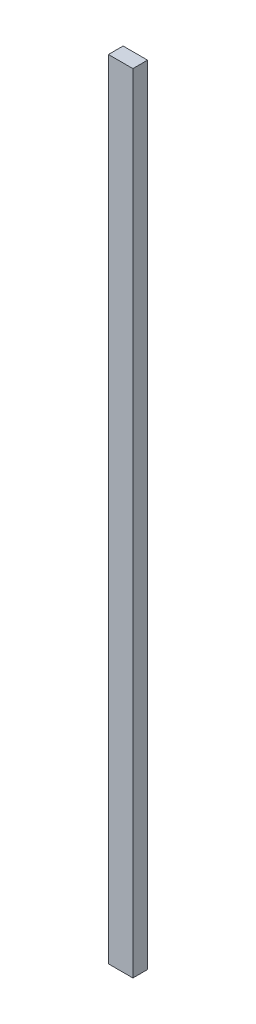
ISO-10303-21;
HEADER;
FILE_DESCRIPTION(('STEP AP214'),'2;1');
FILE_NAME('part.step','',(''),(''),'','','');
FILE_SCHEMA(('AUTOMOTIVE_DESIGN { 1 0 10303 214 1 1 1 1 }'));
ENDSEC;
DATA;
#1=APPLICATION_CONTEXT('core data for automotive mechanical design processes');
#2=APPLICATION_PROTOCOL_DEFINITION('international standard','automotive_design',2000,#1);
#3=PRODUCT_CONTEXT('',#1,'mechanical');
#4=PRODUCT('Part','Part','',(#3));
#5=PRODUCT_RELATED_PRODUCT_CATEGORY('part','',(#4));
#6=PRODUCT_DEFINITION_FORMATION('','',#4);
#7=PRODUCT_DEFINITION_CONTEXT('part definition',#1,'design');
#8=PRODUCT_DEFINITION('design','',#6,#7);
#9=PRODUCT_DEFINITION_SHAPE('','',#8);
#10=(LENGTH_UNIT() NAMED_UNIT(*) SI_UNIT(.MILLI.,.METRE.));
#11=(NAMED_UNIT(*) PLANE_ANGLE_UNIT() SI_UNIT($,.RADIAN.));
#12=(NAMED_UNIT(*) SI_UNIT($,.STERADIAN.) SOLID_ANGLE_UNIT());
#13=UNCERTAINTY_MEASURE_WITH_UNIT(LENGTH_MEASURE(1.E-05),#10,'distance_accuracy_value','');
#14=(GEOMETRIC_REPRESENTATION_CONTEXT(3) GLOBAL_UNCERTAINTY_ASSIGNED_CONTEXT((#13)) GLOBAL_UNIT_ASSIGNED_CONTEXT((#10,
#11,#12)) REPRESENTATION_CONTEXT('',''));
#15=CARTESIAN_POINT('',(0.,0.,0.));
#16=DIRECTION('',(0.,0.,1.));
#17=DIRECTION('',(1.,0.,0.));
#18=AXIS2_PLACEMENT_3D('',#15,#16,#17);
#19=CARTESIAN_POINT('',(0.,0.,6.));
#20=DIRECTION('',(0.,0.,1.));
#21=DIRECTION('',(1.,0.,0.));
#22=AXIS2_PLACEMENT_3D('',#19,#20,#21);
#23=PLANE('',#22);
#24=DIRECTION('',(-1.,0.,0.));
#25=VECTOR('',#24,1.);
#26=CARTESIAN_POINT('',(0.,-161.,6.));
#27=LINE('',#26,#25);
#28=CARTESIAN_POINT('',(5.,-161.,6.));
#29=VERTEX_POINT('',#28);
#30=CARTESIAN_POINT('',(-5.,-161.,6.));
#31=VERTEX_POINT('',#30);
#32=EDGE_CURVE('E11',#29,#31,#27,.T.);
#33=ORIENTED_EDGE('',*,*,#32,.F.);
#34=DIRECTION('',(0.,-1.,0.));
#35=VECTOR('',#34,1.);
#36=CARTESIAN_POINT('',(5.,0.,6.));
#37=LINE('',#36,#35);
#38=CARTESIAN_POINT('',(5.,161.,6.));
#39=VERTEX_POINT('',#38);
#40=EDGE_CURVE('E62',#39,#29,#37,.T.);
#41=ORIENTED_EDGE('',*,*,#40,.F.);
#42=DIRECTION('',(1.,0.,0.));
#43=VECTOR('',#42,1.);
#44=CARTESIAN_POINT('',(0.,161.,6.));
#45=LINE('',#44,#43);
#46=CARTESIAN_POINT('',(-5.,161.,6.));
#47=VERTEX_POINT('',#46);
#48=EDGE_CURVE('E98',#47,#39,#45,.T.);
#49=ORIENTED_EDGE('',*,*,#48,.F.);
#50=DIRECTION('',(0.,1.,0.));
#51=VECTOR('',#50,1.);
#52=CARTESIAN_POINT('',(-5.,0.,6.));
#53=LINE('',#52,#51);
#54=EDGE_CURVE('E25',#31,#47,#53,.T.);
#55=ORIENTED_EDGE('',*,*,#54,.F.);
#56=EDGE_LOOP('',(#33,#41,#49,#55));
#57=FACE_BOUND('',#56,.T.);
#58=ADVANCED_FACE('F17',(#57),#23,.T.);
#59=CARTESIAN_POINT('',(0.,-161.,0.));
#60=DIRECTION('',(0.,-1.,0.));
#61=DIRECTION('',(0.,0.,-1.));
#62=AXIS2_PLACEMENT_3D('',#59,#60,#61);
#63=PLANE('',#62);
#64=DIRECTION('',(0.,0.,1.));
#65=VECTOR('',#64,1.);
#66=CARTESIAN_POINT('',(5.,-161.,0.));
#67=LINE('',#66,#65);
#68=CARTESIAN_POINT('',(5.,-161.,0.));
#69=VERTEX_POINT('',#68);
#70=EDGE_CURVE('E55',#69,#29,#67,.T.);
#71=ORIENTED_EDGE('',*,*,#70,.T.);
#72=ORIENTED_EDGE('',*,*,#32,.T.);
#73=DIRECTION('',(0.,0.,1.));
#74=VECTOR('',#73,1.);
#75=CARTESIAN_POINT('',(-5.,-161.,0.));
#76=LINE('',#75,#74);
#77=CARTESIAN_POINT('',(-5.,-161.,0.));
#78=VERTEX_POINT('',#77);
#79=EDGE_CURVE('E69',#78,#31,#76,.T.);
#80=ORIENTED_EDGE('',*,*,#79,.F.);
#81=DIRECTION('',(1.,0.,0.));
#82=VECTOR('',#81,1.);
#83=CARTESIAN_POINT('',(0.,-161.,0.));
#84=LINE('',#83,#82);
#85=EDGE_CURVE('E67',#78,#69,#84,.T.);
#86=ORIENTED_EDGE('',*,*,#85,.T.);
#87=EDGE_LOOP('',(#71,#72,#80,#86));
#88=FACE_BOUND('',#87,.T.);
#89=ADVANCED_FACE('F68',(#88),#63,.T.);
#90=CARTESIAN_POINT('',(-5.,0.,0.));
#91=DIRECTION('',(-1.,0.,0.));
#92=DIRECTION('',(0.,0.,1.));
#93=AXIS2_PLACEMENT_3D('',#90,#91,#92);
#94=PLANE('',#93);
#95=ORIENTED_EDGE('',*,*,#79,.T.);
#96=ORIENTED_EDGE('',*,*,#54,.T.);
#97=DIRECTION('',(0.,0.,1.));
#98=VECTOR('',#97,1.);
#99=CARTESIAN_POINT('',(-5.,161.,0.));
#100=LINE('',#99,#98);
#101=CARTESIAN_POINT('',(-5.,161.,0.));
#102=VERTEX_POINT('',#101);
#103=EDGE_CURVE('E91',#102,#47,#100,.T.);
#104=ORIENTED_EDGE('',*,*,#103,.F.);
#105=DIRECTION('',(0.,-1.,0.));
#106=VECTOR('',#105,1.);
#107=CARTESIAN_POINT('',(-5.,0.,0.));
#108=LINE('',#107,#106);
#109=EDGE_CURVE('E74',#102,#78,#108,.T.);
#110=ORIENTED_EDGE('',*,*,#109,.T.);
#111=EDGE_LOOP('',(#95,#96,#104,#110));
#112=FACE_BOUND('',#111,.T.);
#113=ADVANCED_FACE('F106',(#112),#94,.T.);
#114=CARTESIAN_POINT('',(0.,161.,0.));
#115=DIRECTION('',(0.,1.,0.));
#116=DIRECTION('',(0.,0.,1.));
#117=AXIS2_PLACEMENT_3D('',#114,#115,#116);
#118=PLANE('',#117);
#119=ORIENTED_EDGE('',*,*,#103,.T.);
#120=ORIENTED_EDGE('',*,*,#48,.T.);
#121=DIRECTION('',(0.,0.,1.));
#122=VECTOR('',#121,1.);
#123=CARTESIAN_POINT('',(5.,161.,0.));
#124=LINE('',#123,#122);
#125=CARTESIAN_POINT('',(5.,161.,0.));
#126=VERTEX_POINT('',#125);
#127=EDGE_CURVE('E64',#126,#39,#124,.T.);
#128=ORIENTED_EDGE('',*,*,#127,.F.);
#129=DIRECTION('',(-1.,0.,0.));
#130=VECTOR('',#129,1.);
#131=CARTESIAN_POINT('',(0.,161.,0.));
#132=LINE('',#131,#130);
#133=EDGE_CURVE('E79',#126,#102,#132,.T.);
#134=ORIENTED_EDGE('',*,*,#133,.T.);
#135=EDGE_LOOP('',(#119,#120,#128,#134));
#136=FACE_BOUND('',#135,.T.);
#137=ADVANCED_FACE('F104',(#136),#118,.T.);
#138=CARTESIAN_POINT('',(0.,0.,0.));
#139=DIRECTION('',(0.,0.,-1.));
#140=DIRECTION('',(-1.,0.,0.));
#141=AXIS2_PLACEMENT_3D('',#138,#139,#140);
#142=PLANE('',#141);
#143=DIRECTION('',(0.,1.,0.));
#144=VECTOR('',#143,1.);
#145=CARTESIAN_POINT('',(5.,0.,0.));
#146=LINE('',#145,#144);
#147=EDGE_CURVE('E60',#69,#126,#146,.T.);
#148=ORIENTED_EDGE('',*,*,#147,.F.);
#149=ORIENTED_EDGE('',*,*,#85,.F.);
#150=ORIENTED_EDGE('',*,*,#109,.F.);
#151=ORIENTED_EDGE('',*,*,#133,.F.);
#152=EDGE_LOOP('',(#148,#149,#150,#151));
#153=FACE_BOUND('',#152,.T.);
#154=ADVANCED_FACE('F77',(#153),#142,.T.);
#155=CARTESIAN_POINT('',(5.,0.,0.));
#156=DIRECTION('',(1.,0.,0.));
#157=DIRECTION('',(0.,0.,-1.));
#158=AXIS2_PLACEMENT_3D('',#155,#156,#157);
#159=PLANE('',#158);
#160=ORIENTED_EDGE('',*,*,#147,.T.);
#161=ORIENTED_EDGE('',*,*,#127,.T.);
#162=ORIENTED_EDGE('',*,*,#40,.T.);
#163=ORIENTED_EDGE('',*,*,#70,.F.);
#164=EDGE_LOOP('',(#160,#161,#162,#163));
#165=FACE_BOUND('',#164,.T.);
#166=ADVANCED_FACE('F57',(#165),#159,.T.);
#167=CLOSED_SHELL('',(#58,#89,#113,#137,#154,#166));
#168=MANIFOLD_SOLID_BREP('B1',#167);
#169=ADVANCED_BREP_SHAPE_REPRESENTATION('',(#18,#168),#14);
#170=SHAPE_DEFINITION_REPRESENTATION(#9,#169);
ENDSEC;
END-ISO-10303-21;
